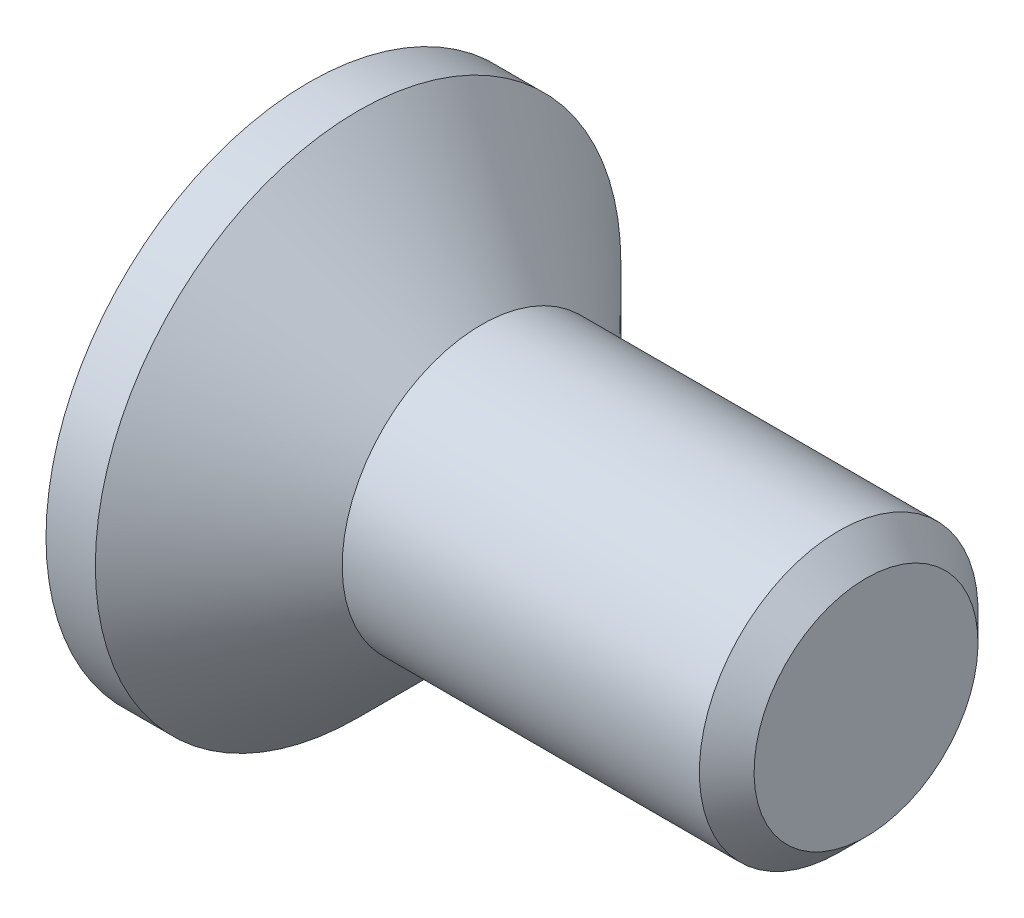
ISO-10303-21;
HEADER;
FILE_DESCRIPTION(('STEP AP214'),'2;1');
FILE_NAME('part.step','',(''),(''),'','','');
FILE_SCHEMA(('AUTOMOTIVE_DESIGN { 1 0 10303 214 1 1 1 1 }'));
ENDSEC;
DATA;
#1=APPLICATION_CONTEXT('core data for automotive mechanical design processes');
#2=APPLICATION_PROTOCOL_DEFINITION('international standard','automotive_design',2000,#1);
#3=PRODUCT_CONTEXT('',#1,'mechanical');
#4=PRODUCT('Part','Part','',(#3));
#5=PRODUCT_RELATED_PRODUCT_CATEGORY('part','',(#4));
#6=PRODUCT_DEFINITION_FORMATION('','',#4);
#7=PRODUCT_DEFINITION_CONTEXT('part definition',#1,'design');
#8=PRODUCT_DEFINITION('design','',#6,#7);
#9=PRODUCT_DEFINITION_SHAPE('','',#8);
#10=(LENGTH_UNIT() NAMED_UNIT(*) SI_UNIT(.MILLI.,.METRE.));
#11=(NAMED_UNIT(*) PLANE_ANGLE_UNIT() SI_UNIT($,.RADIAN.));
#12=(NAMED_UNIT(*) SI_UNIT($,.STERADIAN.) SOLID_ANGLE_UNIT());
#13=UNCERTAINTY_MEASURE_WITH_UNIT(LENGTH_MEASURE(1.E-05),#10,'distance_accuracy_value','');
#14=(GEOMETRIC_REPRESENTATION_CONTEXT(3) GLOBAL_UNCERTAINTY_ASSIGNED_CONTEXT((#13)) GLOBAL_UNIT_ASSIGNED_CONTEXT((#10,
#11,#12)) REPRESENTATION_CONTEXT('',''));
#15=CARTESIAN_POINT('',(0.,0.,0.));
#16=DIRECTION('',(0.,0.,1.));
#17=DIRECTION('',(1.,0.,0.));
#18=AXIS2_PLACEMENT_3D('',#15,#16,#17);
#19=CARTESIAN_POINT('',(1.9925,0.,0.));
#20=DIRECTION('',(-1.,0.,0.));
#21=DIRECTION('',(0.,1.,0.));
#22=AXIS2_PLACEMENT_3D('',#19,#20,#21);
#23=CONICAL_SURFACE('',#22,3.6075,0.785398163397447);
#24=CARTESIAN_POINT('',(0.884999999999976,0.,0.));
#25=DIRECTION('',(1.,0.,0.));
#26=DIRECTION('',(0.,1.,0.));
#27=AXIS2_PLACEMENT_3D('',#24,#25,#26);
#28=CIRCLE('',#27,4.715);
#29=CARTESIAN_POINT('',(0.884999999999976,-4.715,0.));
#30=VERTEX_POINT('',#29);
#31=EDGE_CURVE('E142',#30,#30,#28,.T.);
#32=ORIENTED_EDGE('',*,*,#31,.T.);
#33=DIRECTION('',(0.707106781186549,0.707106781186546,0.));
#34=VECTOR('',#33,1.);
#35=CARTESIAN_POINT('',(1.9925,-3.6075,0.));
#36=LINE('',#35,#34);
#37=CARTESIAN_POINT('',(3.1,-2.5,0.));
#38=VERTEX_POINT('',#37);
#39=EDGE_CURVE('E11',#30,#38,#36,.T.);
#40=ORIENTED_EDGE('',*,*,#39,.T.);
#41=CARTESIAN_POINT('',(3.1,0.,0.));
#42=DIRECTION('',(1.,0.,0.));
#43=DIRECTION('',(0.,1.,0.));
#44=AXIS2_PLACEMENT_3D('',#41,#42,#43);
#45=CIRCLE('',#44,2.5);
#46=EDGE_CURVE('E147',#38,#38,#45,.T.);
#47=ORIENTED_EDGE('',*,*,#46,.F.);
#48=ORIENTED_EDGE('',*,*,#39,.F.);
#49=EDGE_LOOP('',(#32,#40,#47,#48));
#50=FACE_BOUND('',#49,.T.);
#51=ADVANCED_FACE('F17',(#50),#23,.T.);
#52=CARTESIAN_POINT('',(0.442499999999988,0.,0.));
#53=DIRECTION('',(1.,0.,0.));
#54=DIRECTION('',(0.,1.,0.));
#55=AXIS2_PLACEMENT_3D('',#52,#53,#54);
#56=CYLINDRICAL_SURFACE('',#55,4.715);
#57=ORIENTED_EDGE('',*,*,#31,.F.);
#58=DIRECTION('',(-1.,0.,0.));
#59=VECTOR('',#58,1.);
#60=CARTESIAN_POINT('',(0.442499999999988,-4.715,0.));
#61=LINE('',#60,#59);
#62=CARTESIAN_POINT('',(0.,-4.715,0.));
#63=VERTEX_POINT('',#62);
#64=EDGE_CURVE('E27',#30,#63,#61,.T.);
#65=ORIENTED_EDGE('',*,*,#64,.T.);
#66=CARTESIAN_POINT('',(0.,0.,0.));
#67=DIRECTION('',(1.,0.,0.));
#68=DIRECTION('',(0.,1.,0.));
#69=AXIS2_PLACEMENT_3D('',#66,#67,#68);
#70=CIRCLE('',#69,4.715);
#71=EDGE_CURVE('E151',#63,#63,#70,.T.);
#72=ORIENTED_EDGE('',*,*,#71,.T.);
#73=ORIENTED_EDGE('',*,*,#64,.F.);
#74=EDGE_LOOP('',(#57,#65,#72,#73));
#75=FACE_BOUND('',#74,.T.);
#76=ADVANCED_FACE('F273',(#75),#56,.T.);
#77=CARTESIAN_POINT('',(0.,3.22352540378444,0.));
#78=DIRECTION('',(-1.,0.,0.));
#79=DIRECTION('',(0.,0.,1.));
#80=AXIS2_PLACEMENT_3D('',#77,#78,#79);
#81=PLANE('',#80);
#82=DIRECTION('',(0.,0.,1.));
#83=VECTOR('',#82,1.);
#84=CARTESIAN_POINT('',(0.,1.5,-0.866025403784439));
#85=LINE('',#84,#83);
#86=CARTESIAN_POINT('',(0.,1.5,-0.866025403784439));
#87=VERTEX_POINT('',#86);
#88=CARTESIAN_POINT('',(0.,1.5,0.866025403784437));
#89=VERTEX_POINT('',#88);
#90=EDGE_CURVE('E192',#87,#89,#85,.T.);
#91=ORIENTED_EDGE('',*,*,#90,.T.);
#92=DIRECTION('',(0.,-0.866025403784439,0.5));
#93=VECTOR('',#92,1.);
#94=CARTESIAN_POINT('',(0.,1.5,0.866025403784437));
#95=LINE('',#94,#93);
#96=CARTESIAN_POINT('',(0.,0.,1.73205080756888));
#97=VERTEX_POINT('',#96);
#98=EDGE_CURVE('E162',#89,#97,#95,.T.);
#99=ORIENTED_EDGE('',*,*,#98,.T.);
#100=DIRECTION('',(0.,-0.866025403784439,-0.5));
#101=VECTOR('',#100,1.);
#102=CARTESIAN_POINT('',(0.,0.,1.73205080756888));
#103=LINE('',#102,#101);
#104=CARTESIAN_POINT('',(0.,-1.5,0.866025403784439));
#105=VERTEX_POINT('',#104);
#106=EDGE_CURVE('E124',#97,#105,#103,.T.);
#107=ORIENTED_EDGE('',*,*,#106,.T.);
#108=DIRECTION('',(0.,0.,-1.));
#109=VECTOR('',#108,1.);
#110=CARTESIAN_POINT('',(0.,-1.5,0.866025403784439));
#111=LINE('',#110,#109);
#112=CARTESIAN_POINT('',(0.,-1.5,-0.866025403784439));
#113=VERTEX_POINT('',#112);
#114=EDGE_CURVE('E118',#105,#113,#111,.T.);
#115=ORIENTED_EDGE('',*,*,#114,.T.);
#116=DIRECTION('',(0.,0.866025403784439,-0.5));
#117=VECTOR('',#116,1.);
#118=CARTESIAN_POINT('',(0.,-1.5,-0.866025403784438));
#119=LINE('',#118,#117);
#120=CARTESIAN_POINT('',(0.,0.,-1.73205080756888));
#121=VERTEX_POINT('',#120);
#122=EDGE_CURVE('E136',#113,#121,#119,.T.);
#123=ORIENTED_EDGE('',*,*,#122,.T.);
#124=DIRECTION('',(0.,0.866025403784439,0.5));
#125=VECTOR('',#124,1.);
#126=CARTESIAN_POINT('',(0.,0.,-1.73205080756888));
#127=LINE('',#126,#125);
#128=EDGE_CURVE('E146',#121,#87,#127,.T.);
#129=ORIENTED_EDGE('',*,*,#128,.T.);
#130=EDGE_LOOP('',(#91,#99,#107,#115,#123,#129));
#131=FACE_BOUND('',#130,.T.);
#132=ORIENTED_EDGE('',*,*,#71,.F.);
#133=EDGE_LOOP('',(#132));
#134=FACE_BOUND('',#133,.T.);
#135=ADVANCED_FACE('F247',(#131,#134),#81,.T.);
#136=CARTESIAN_POINT('',(2.32264973081038,0.,0.));
#137=DIRECTION('',(-1.,0.,0.));
#138=DIRECTION('',(0.,1.,0.));
#139=AXIS2_PLACEMENT_3D('',#136,#137,#138);
#140=CONICAL_SURFACE('',#139,1.,1.0471975511966);
#141=DIRECTION('',(-0.5,-0.866025403784439,0.));
#142=VECTOR('',#141,1.);
#143=CARTESIAN_POINT('',(2.32264973081038,-1.,0.));
#144=LINE('',#143,#142);
#145=CARTESIAN_POINT('',(2.9,0.,0.));
#146=VERTEX_POINT('',#145);
#147=CARTESIAN_POINT('',(2.03397459621556,-1.5,0.));
#148=VERTEX_POINT('',#147);
#149=EDGE_CURVE('E155',#146,#148,#144,.T.);
#150=ORIENTED_EDGE('',*,*,#149,.T.);
#151=CARTESIAN_POINT('',(2.03397459621556,-1.5,0.));
#152=CARTESIAN_POINT('',(2.03397459621556,-1.5,0.401923788646685));
#153=CARTESIAN_POINT('',(1.9,-1.5,0.866025403784441));
#154=(BOUNDED_CURVE() B_SPLINE_CURVE(2,(#151,#152,#153),.UNSPECIFIED.,.F.,
.F.) B_SPLINE_CURVE_WITH_KNOTS((3,3),(0.0876327103558439,0.175265420711688),
.UNSPECIFIED.) CURVE() GEOMETRIC_REPRESENTATION_ITEM() RATIONAL_B_SPLINE_CURVE((1.07735026918963,
1.07735026918963,1.)) REPRESENTATION_ITEM(''));
#155=CARTESIAN_POINT('',(1.9,-1.5,0.866025403784439));
#156=VERTEX_POINT('',#155);
#157=EDGE_CURVE('E196',#148,#156,#154,.T.);
#158=ORIENTED_EDGE('',*,*,#157,.T.);
#159=CARTESIAN_POINT('',(1.9,-1.5,0.866025403784439));
#160=CARTESIAN_POINT('',(2.15,-0.750000000000001,1.29903810567666));
#161=CARTESIAN_POINT('',(1.9,0.,1.73205080756888));
#162=(BOUNDED_CURVE() B_SPLINE_CURVE(2,(#159,#160,#161),.UNSPECIFIED.,.F.,
.F.) B_SPLINE_CURVE_WITH_KNOTS((3,3),(0.,0.175265420711688),
.UNSPECIFIED.) CURVE() GEOMETRIC_REPRESENTATION_ITEM() RATIONAL_B_SPLINE_CURVE((1.,
1.15470053837925,1.)) REPRESENTATION_ITEM(''));
#163=CARTESIAN_POINT('',(1.9,0.,1.73205080756888));
#164=VERTEX_POINT('',#163);
#165=EDGE_CURVE('E129',#156,#164,#162,.T.);
#166=ORIENTED_EDGE('',*,*,#165,.T.);
#167=CARTESIAN_POINT('',(1.9,0.,1.73205080756888));
#168=CARTESIAN_POINT('',(2.15,0.750000000000001,1.29903810567666));
#169=CARTESIAN_POINT('',(1.9,1.5,0.866025403784436));
#170=(BOUNDED_CURVE() B_SPLINE_CURVE(2,(#167,#168,#169),.UNSPECIFIED.,.F.,
.F.) B_SPLINE_CURVE_WITH_KNOTS((3,3),(0.,0.175265420711688),
.UNSPECIFIED.) CURVE() GEOMETRIC_REPRESENTATION_ITEM() RATIONAL_B_SPLINE_CURVE((1.,
1.15470053837925,1.)) REPRESENTATION_ITEM(''));
#171=CARTESIAN_POINT('',(1.9,1.5,0.866025403784437));
#172=VERTEX_POINT('',#171);
#173=EDGE_CURVE('E156',#164,#172,#170,.T.);
#174=ORIENTED_EDGE('',*,*,#173,.T.);
#175=CARTESIAN_POINT('',(1.9,1.5,0.866025403784439));
#176=CARTESIAN_POINT('',(2.15,1.5,0.));
#177=CARTESIAN_POINT('',(1.9,1.5,-0.866025403784441));
#178=(BOUNDED_CURVE() B_SPLINE_CURVE(2,(#175,#176,#177),.UNSPECIFIED.,.F.,
.F.) B_SPLINE_CURVE_WITH_KNOTS((3,3),(0.,0.175265420711688),
.UNSPECIFIED.) CURVE() GEOMETRIC_REPRESENTATION_ITEM() RATIONAL_B_SPLINE_CURVE((1.,
1.15470053837925,1.)) REPRESENTATION_ITEM(''));
#179=CARTESIAN_POINT('',(1.9,1.5,-0.866025403784439));
#180=VERTEX_POINT('',#179);
#181=EDGE_CURVE('E182',#172,#180,#178,.T.);
#182=ORIENTED_EDGE('',*,*,#181,.T.);
#183=CARTESIAN_POINT('',(1.9,1.5,-0.866025403784438));
#184=CARTESIAN_POINT('',(2.15,0.75,-1.29903810567665));
#185=CARTESIAN_POINT('',(1.9,0.,-1.73205080756888));
#186=(BOUNDED_CURVE() B_SPLINE_CURVE(2,(#183,#184,#185),.UNSPECIFIED.,.F.,
.F.) B_SPLINE_CURVE_WITH_KNOTS((3,3),(0.,0.175265420711688),
.UNSPECIFIED.) CURVE() GEOMETRIC_REPRESENTATION_ITEM() RATIONAL_B_SPLINE_CURVE((1.,
1.15470053837926,1.)) REPRESENTATION_ITEM(''));
#187=CARTESIAN_POINT('',(1.9,0.,-1.73205080756888));
#188=VERTEX_POINT('',#187);
#189=EDGE_CURVE('E130',#180,#188,#186,.T.);
#190=ORIENTED_EDGE('',*,*,#189,.T.);
#191=CARTESIAN_POINT('',(1.9,0.,-1.73205080756888));
#192=CARTESIAN_POINT('',(2.15,-0.749999999999999,-1.29903810567666));
#193=CARTESIAN_POINT('',(1.9,-1.5,-0.866025403784438));
#194=(BOUNDED_CURVE() B_SPLINE_CURVE(2,(#191,#192,#193),.UNSPECIFIED.,.F.,
.F.) B_SPLINE_CURVE_WITH_KNOTS((3,3),(0.,0.175265420711688),
.UNSPECIFIED.) CURVE() GEOMETRIC_REPRESENTATION_ITEM() RATIONAL_B_SPLINE_CURVE((1.,
1.15470053837925,1.)) REPRESENTATION_ITEM(''));
#195=CARTESIAN_POINT('',(1.9,-1.5,-0.866025403784439));
#196=VERTEX_POINT('',#195);
#197=EDGE_CURVE('E170',#188,#196,#194,.T.);
#198=ORIENTED_EDGE('',*,*,#197,.T.);
#199=CARTESIAN_POINT('',(1.9,-1.5,-0.86602540378444));
#200=CARTESIAN_POINT('',(2.03397459621556,-1.5,-0.401923788646684));
#201=CARTESIAN_POINT('',(2.03397459621556,-1.5,0.));
#202=(BOUNDED_CURVE() B_SPLINE_CURVE(2,(#199,#200,#201),.UNSPECIFIED.,.F.,
.F.) B_SPLINE_CURVE_WITH_KNOTS((3,3),(0.,0.0876327103558439),
.UNSPECIFIED.) CURVE() GEOMETRIC_REPRESENTATION_ITEM() RATIONAL_B_SPLINE_CURVE((1.,
1.07735026918963,1.07735026918963)) REPRESENTATION_ITEM(''));
#203=EDGE_CURVE('E150',#196,#148,#202,.T.);
#204=ORIENTED_EDGE('',*,*,#203,.T.);
#205=ORIENTED_EDGE('',*,*,#149,.F.);
#206=EDGE_LOOP('',(#150,#158,#166,#174,#182,#190,#198,#204,#205));
#207=FACE_BOUND('',#206,.T.);
#208=ADVANCED_FACE('F284',(#207),#140,.F.);
#209=CARTESIAN_POINT('',(0.,0.,1.73205080756888));
#210=DIRECTION('',(0.,0.5,0.866025403784439));
#211=DIRECTION('',(1.,0.,0.));
#212=AXIS2_PLACEMENT_3D('',#209,#210,#211);
#213=PLANE('',#212);
#214=ORIENTED_EDGE('',*,*,#173,.F.);
#215=DIRECTION('',(-1.,0.,0.));
#216=VECTOR('',#215,1.);
#217=CARTESIAN_POINT('',(1.9,0.,1.73205080756888));
#218=LINE('',#217,#216);
#219=EDGE_CURVE('E128',#164,#97,#218,.T.);
#220=ORIENTED_EDGE('',*,*,#219,.T.);
#221=ORIENTED_EDGE('',*,*,#98,.F.);
#222=DIRECTION('',(1.,0.,0.));
#223=VECTOR('',#222,1.);
#224=CARTESIAN_POINT('',(0.,1.5,0.866025403784437));
#225=LINE('',#224,#223);
#226=EDGE_CURVE('E188',#89,#172,#225,.T.);
#227=ORIENTED_EDGE('',*,*,#226,.T.);
#228=EDGE_LOOP('',(#214,#220,#221,#227));
#229=FACE_BOUND('',#228,.T.);
#230=ADVANCED_FACE('F238',(#229),#213,.F.);
#231=CARTESIAN_POINT('',(0.,-1.5,0.866025403784439));
#232=DIRECTION('',(0.,-0.5,0.866025403784439));
#233=DIRECTION('',(-1.,0.,0.));
#234=AXIS2_PLACEMENT_3D('',#231,#232,#233);
#235=PLANE('',#234);
#236=ORIENTED_EDGE('',*,*,#165,.F.);
#237=DIRECTION('',(-1.,0.,0.));
#238=VECTOR('',#237,1.);
#239=CARTESIAN_POINT('',(1.9,-1.5,0.866025403784439));
#240=LINE('',#239,#238);
#241=EDGE_CURVE('E122',#156,#105,#240,.T.);
#242=ORIENTED_EDGE('',*,*,#241,.T.);
#243=ORIENTED_EDGE('',*,*,#106,.F.);
#244=ORIENTED_EDGE('',*,*,#219,.F.);
#245=EDGE_LOOP('',(#236,#242,#243,#244));
#246=FACE_BOUND('',#245,.T.);
#247=ADVANCED_FACE('F243',(#246),#235,.F.);
#248=CARTESIAN_POINT('',(0.,1.5,0.866025403784437));
#249=DIRECTION('',(0.,1.,0.));
#250=DIRECTION('',(1.,0.,0.));
#251=AXIS2_PLACEMENT_3D('',#248,#249,#250);
#252=PLANE('',#251);
#253=ORIENTED_EDGE('',*,*,#181,.F.);
#254=ORIENTED_EDGE('',*,*,#226,.F.);
#255=ORIENTED_EDGE('',*,*,#90,.F.);
#256=DIRECTION('',(-1.,0.,0.));
#257=VECTOR('',#256,1.);
#258=CARTESIAN_POINT('',(1.9,1.5,-0.866025403784439));
#259=LINE('',#258,#257);
#260=EDGE_CURVE('E135',#180,#87,#259,.T.);
#261=ORIENTED_EDGE('',*,*,#260,.F.);
#262=EDGE_LOOP('',(#253,#254,#255,#261));
#263=FACE_BOUND('',#262,.T.);
#264=ADVANCED_FACE('F301',(#263),#252,.F.);
#265=CARTESIAN_POINT('',(0.,1.5,-0.866025403784439));
#266=DIRECTION('',(0.,0.5,-0.866025403784439));
#267=DIRECTION('',(-1.,0.,0.));
#268=AXIS2_PLACEMENT_3D('',#265,#266,#267);
#269=PLANE('',#268);
#270=ORIENTED_EDGE('',*,*,#189,.F.);
#271=ORIENTED_EDGE('',*,*,#260,.T.);
#272=ORIENTED_EDGE('',*,*,#128,.F.);
#273=DIRECTION('',(-1.,0.,0.));
#274=VECTOR('',#273,1.);
#275=CARTESIAN_POINT('',(1.9,0.,-1.73205080756888));
#276=LINE('',#275,#274);
#277=EDGE_CURVE('E163',#188,#121,#276,.T.);
#278=ORIENTED_EDGE('',*,*,#277,.F.);
#279=EDGE_LOOP('',(#270,#271,#272,#278));
#280=FACE_BOUND('',#279,.T.);
#281=ADVANCED_FACE('F306',(#280),#269,.F.);
#282=CARTESIAN_POINT('',(0.,0.,-1.73205080756888));
#283=DIRECTION('',(0.,-0.5,-0.866025403784439));
#284=DIRECTION('',(0.,-0.866025403784439,0.5));
#285=AXIS2_PLACEMENT_3D('',#282,#283,#284);
#286=PLANE('',#285);
#287=ORIENTED_EDGE('',*,*,#197,.F.);
#288=ORIENTED_EDGE('',*,*,#277,.T.);
#289=ORIENTED_EDGE('',*,*,#122,.F.);
#290=DIRECTION('',(-1.,0.,0.));
#291=VECTOR('',#290,1.);
#292=CARTESIAN_POINT('',(1.9,-1.5,-0.866025403784439));
#293=LINE('',#292,#291);
#294=EDGE_CURVE('E123',#196,#113,#293,.T.);
#295=ORIENTED_EDGE('',*,*,#294,.F.);
#296=EDGE_LOOP('',(#287,#288,#289,#295));
#297=FACE_BOUND('',#296,.T.);
#298=ADVANCED_FACE('F345',(#297),#286,.F.);
#299=CARTESIAN_POINT('',(0.,-1.5,-0.866025403784439));
#300=DIRECTION('',(0.,-1.,0.));
#301=DIRECTION('',(0.,0.,-1.));
#302=AXIS2_PLACEMENT_3D('',#299,#300,#301);
#303=PLANE('',#302);
#304=ORIENTED_EDGE('',*,*,#203,.F.);
#305=ORIENTED_EDGE('',*,*,#294,.T.);
#306=ORIENTED_EDGE('',*,*,#114,.F.);
#307=ORIENTED_EDGE('',*,*,#241,.F.);
#308=ORIENTED_EDGE('',*,*,#157,.F.);
#309=EDGE_LOOP('',(#304,#305,#306,#307,#308));
#310=FACE_BOUND('',#309,.T.);
#311=ADVANCED_FACE('F356',(#310),#303,.F.);
#312=CARTESIAN_POINT('',(10.,1.25,0.));
#313=DIRECTION('',(1.,0.,0.));
#314=DIRECTION('',(0.,1.,0.));
#315=AXIS2_PLACEMENT_3D('',#312,#313,#314);
#316=PLANE('',#315);
#317=CARTESIAN_POINT('',(10.,0.,0.));
#318=DIRECTION('',(-1.,0.,0.));
#319=DIRECTION('',(0.,-1.,0.));
#320=AXIS2_PLACEMENT_3D('',#317,#318,#319);
#321=CIRCLE('',#320,2.00924);
#322=CARTESIAN_POINT('',(10.,2.00924,0.));
#323=VERTEX_POINT('',#322);
#324=EDGE_CURVE('E100',#323,#323,#321,.T.);
#325=ORIENTED_EDGE('',*,*,#324,.F.);
#326=EDGE_LOOP('',(#325));
#327=FACE_BOUND('',#326,.T.);
#328=ADVANCED_FACE('F317',(#327),#316,.T.);
#329=CARTESIAN_POINT('',(7.595,0.,0.));
#330=DIRECTION('',(1.,0.,0.));
#331=DIRECTION('',(0.,1.,0.));
#332=AXIS2_PLACEMENT_3D('',#329,#330,#331);
#333=CYLINDRICAL_SURFACE('',#332,2.5);
#334=CARTESIAN_POINT('',(9.50924,0.,0.));
#335=DIRECTION('',(1.,0.,0.));
#336=DIRECTION('',(0.,-1.,0.));
#337=AXIS2_PLACEMENT_3D('',#334,#335,#336);
#338=CIRCLE('',#337,2.5);
#339=CARTESIAN_POINT('',(9.50924,2.5,0.));
#340=VERTEX_POINT('',#339);
#341=CARTESIAN_POINT('',(9.50924,-2.5,0.));
#342=VERTEX_POINT('',#341);
#343=EDGE_CURVE('E98',#340,#342,#338,.T.);
#344=ORIENTED_EDGE('',*,*,#343,.F.);
#345=CARTESIAN_POINT('',(9.50924,0.,0.));
#346=DIRECTION('',(1.,0.,0.));
#347=DIRECTION('',(0.,-1.,0.));
#348=AXIS2_PLACEMENT_3D('',#345,#346,#347);
#349=CIRCLE('',#348,2.5);
#350=EDGE_CURVE('E20',#342,#340,#349,.T.);
#351=ORIENTED_EDGE('',*,*,#350,.F.);
#352=DIRECTION('',(-1.,0.,0.));
#353=VECTOR('',#352,1.);
#354=CARTESIAN_POINT('',(7.595,-2.5,0.));
#355=LINE('',#354,#353);
#356=EDGE_CURVE('E109',#342,#38,#355,.T.);
#357=ORIENTED_EDGE('',*,*,#356,.T.);
#358=ORIENTED_EDGE('',*,*,#46,.T.);
#359=ORIENTED_EDGE('',*,*,#356,.F.);
#360=EDGE_LOOP('',(#344,#351,#357,#358,#359));
#361=FACE_BOUND('',#360,.T.);
#362=ADVANCED_FACE('F107',(#361),#333,.T.);
#363=CARTESIAN_POINT('',(9.75462,0.,0.));
#364=DIRECTION('',(-1.,0.,0.));
#365=DIRECTION('',(0.,-1.,0.));
#366=AXIS2_PLACEMENT_3D('',#363,#364,#365);
#367=CONICAL_SURFACE('',#366,2.25462,0.785398163397448);
#368=ORIENTED_EDGE('',*,*,#343,.T.);
#369=ORIENTED_EDGE('',*,*,#350,.T.);
#370=DIRECTION('',(0.707106781186548,-0.707106781186547,0.));
#371=VECTOR('',#370,1.);
#372=CARTESIAN_POINT('',(9.75462,2.25462,0.));
#373=LINE('',#372,#371);
#374=EDGE_CURVE('E94',#340,#323,#373,.T.);
#375=ORIENTED_EDGE('',*,*,#374,.T.);
#376=ORIENTED_EDGE('',*,*,#324,.T.);
#377=ORIENTED_EDGE('',*,*,#374,.F.);
#378=EDGE_LOOP('',(#368,#369,#375,#376,#377));
#379=FACE_BOUND('',#378,.T.);
#380=ADVANCED_FACE('F96',(#379),#367,.T.);
#381=CLOSED_SHELL('',(#51,#76,#135,#208,#230,#247,#264,#281,#298,#311,#328,#362,#380));
#382=MANIFOLD_SOLID_BREP('B1',#381);
#383=ADVANCED_BREP_SHAPE_REPRESENTATION('',(#18,#382),#14);
#384=SHAPE_DEFINITION_REPRESENTATION(#9,#383);
ENDSEC;
END-ISO-10303-21;
